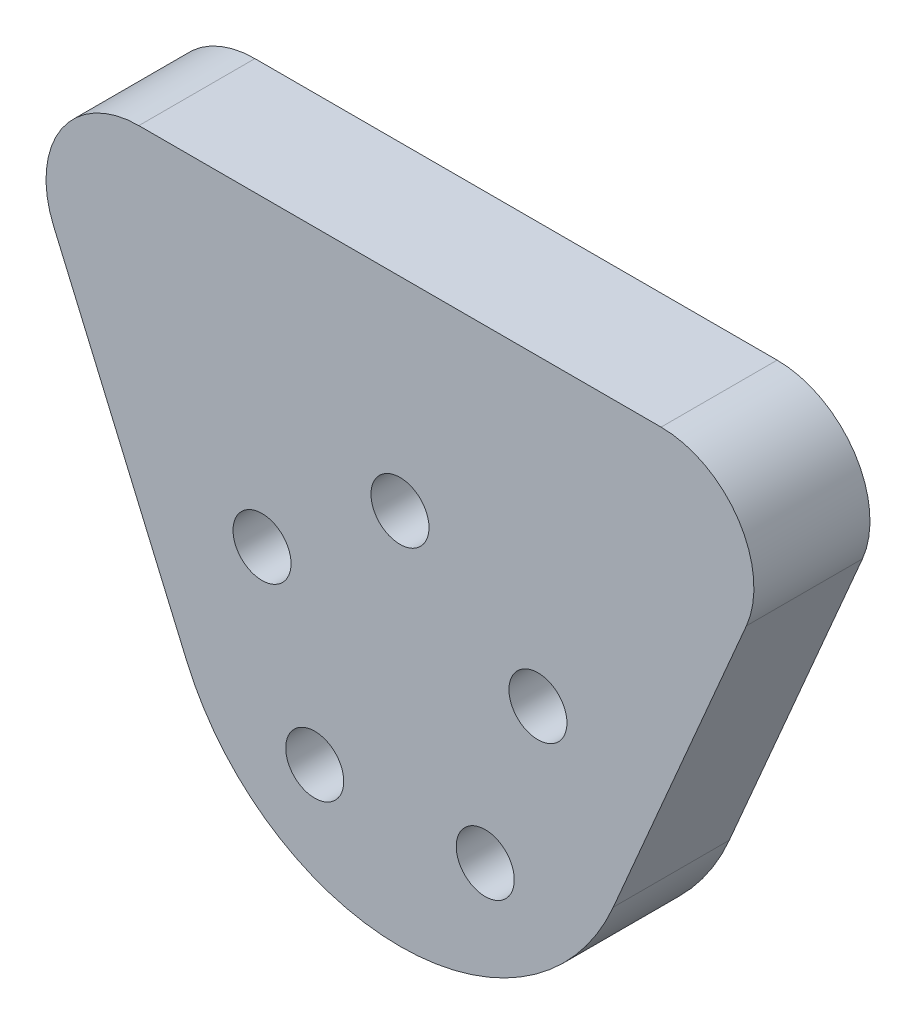
ISO-10303-21;
HEADER;
FILE_DESCRIPTION(('STEP AP214'),'2;1');
FILE_NAME('part.step','',(''),(''),'','','');
FILE_SCHEMA(('AUTOMOTIVE_DESIGN { 1 0 10303 214 1 1 1 1 }'));
ENDSEC;
DATA;
#1=APPLICATION_CONTEXT('core data for automotive mechanical design processes');
#2=APPLICATION_PROTOCOL_DEFINITION('international standard','automotive_design',2000,#1);
#3=PRODUCT_CONTEXT('',#1,'mechanical');
#4=PRODUCT('Part','Part','',(#3));
#5=PRODUCT_RELATED_PRODUCT_CATEGORY('part','',(#4));
#6=PRODUCT_DEFINITION_FORMATION('','',#4);
#7=PRODUCT_DEFINITION_CONTEXT('part definition',#1,'design');
#8=PRODUCT_DEFINITION('design','',#6,#7);
#9=PRODUCT_DEFINITION_SHAPE('','',#8);
#10=(LENGTH_UNIT() NAMED_UNIT(*) SI_UNIT(.MILLI.,.METRE.));
#11=(NAMED_UNIT(*) PLANE_ANGLE_UNIT() SI_UNIT($,.RADIAN.));
#12=(NAMED_UNIT(*) SI_UNIT($,.STERADIAN.) SOLID_ANGLE_UNIT());
#13=UNCERTAINTY_MEASURE_WITH_UNIT(LENGTH_MEASURE(1.E-05),#10,'distance_accuracy_value','');
#14=(GEOMETRIC_REPRESENTATION_CONTEXT(3) GLOBAL_UNCERTAINTY_ASSIGNED_CONTEXT((#13)) GLOBAL_UNIT_ASSIGNED_CONTEXT((#10,
#11,#12)) REPRESENTATION_CONTEXT('',''));
#15=CARTESIAN_POINT('',(0.,0.,0.));
#16=DIRECTION('',(0.,0.,1.));
#17=DIRECTION('',(1.,0.,0.));
#18=AXIS2_PLACEMENT_3D('',#15,#16,#17);
#19=CARTESIAN_POINT('',(-45.,0.,10.));
#20=DIRECTION('',(0.,0.,1.));
#21=DIRECTION('',(1.,0.,0.));
#22=AXIS2_PLACEMENT_3D('',#19,#20,#21);
#23=PLANE('',#22);
#24=CARTESIAN_POINT('',(-29.8473156536559,-32.1127124296868,10.));
#25=DIRECTION('',(0.,0.,1.));
#26=DIRECTION('',(1.,0.,0.));
#27=AXIS2_PLACEMENT_3D('',#24,#25,#26);
#28=CIRCLE('',#27,2.49999999999999);
#29=CARTESIAN_POINT('',(-27.3473156536559,-32.1127124296868,10.));
#30=VERTEX_POINT('',#29);
#31=EDGE_CURVE('E199',#30,#30,#28,.T.);
#32=ORIENTED_EDGE('',*,*,#31,.F.);
#33=EDGE_LOOP('',(#32));
#34=FACE_BOUND('',#33,.T.);
#35=CARTESIAN_POINT('',(-10.6117935463106,-18.1372875703131,10.));
#36=DIRECTION('',(0.,0.,1.));
#37=DIRECTION('',(1.,0.,0.));
#38=AXIS2_PLACEMENT_3D('',#35,#36,#37);
#39=CIRCLE('',#38,2.5);
#40=CARTESIAN_POINT('',(-8.11179354631056,-18.1372875703131,10.));
#41=VERTEX_POINT('',#40);
#42=EDGE_CURVE('E211',#41,#41,#39,.T.);
#43=ORIENTED_EDGE('',*,*,#42,.F.);
#44=EDGE_LOOP('',(#43));
#45=FACE_BOUND('',#44,.T.);
#46=CARTESIAN_POINT('',(-45.,0.,10.));
#47=DIRECTION('',(0.,0.,1.));
#48=DIRECTION('',(1.,0.,0.));
#49=AXIS2_PLACEMENT_3D('',#46,#47,#48);
#50=CIRCLE('',#49,8.);
#51=CARTESIAN_POINT('',(-45.,8.,10.));
#52=VERTEX_POINT('',#51);
#53=CARTESIAN_POINT('',(-52.3515841950434,-3.15502929038525,10.));
#54=VERTEX_POINT('',#53);
#55=EDGE_CURVE('E135',#52,#54,#50,.T.);
#56=ORIENTED_EDGE('',*,*,#55,.T.);
#57=DIRECTION('',(0.394378661298155,-0.918948024380419,0.));
#58=VECTOR('',#57,1.);
#59=CARTESIAN_POINT('',(-52.3515841950434,-3.15502929038525,10.));
#60=LINE('',#59,#58);
#61=CARTESIAN_POINT('',(-40.8789604876084,-29.8875732259631,10.));
#62=VERTEX_POINT('',#61);
#63=EDGE_CURVE('E93',#54,#62,#60,.T.);
#64=ORIENTED_EDGE('',*,*,#63,.T.);
#65=CARTESIAN_POINT('',(-22.5,-22.,10.));
#66=DIRECTION('',(0.,0.,1.));
#67=DIRECTION('',(1.,0.,0.));
#68=AXIS2_PLACEMENT_3D('',#65,#66,#67);
#69=CIRCLE('',#68,20.);
#70=CARTESIAN_POINT('',(-4.12103951239162,-29.8875732259631,10.));
#71=VERTEX_POINT('',#70);
#72=EDGE_CURVE('E106',#62,#71,#69,.T.);
#73=ORIENTED_EDGE('',*,*,#72,.T.);
#74=DIRECTION('',(0.394378661298155,0.918948024380419,0.));
#75=VECTOR('',#74,1.);
#76=CARTESIAN_POINT('',(7.35158419504335,-3.15502929038524,10.));
#77=LINE('',#76,#75);
#78=CARTESIAN_POINT('',(7.35158419504335,-3.15502929038525,10.));
#79=VERTEX_POINT('',#78);
#80=EDGE_CURVE('E100',#71,#79,#77,.T.);
#81=ORIENTED_EDGE('',*,*,#80,.T.);
#82=CARTESIAN_POINT('',(0.,0.,10.));
#83=DIRECTION('',(0.,0.,1.));
#84=DIRECTION('',(1.,0.,0.));
#85=AXIS2_PLACEMENT_3D('',#82,#83,#84);
#86=CIRCLE('',#85,8.);
#87=CARTESIAN_POINT('',(0.,8.,10.));
#88=VERTEX_POINT('',#87);
#89=EDGE_CURVE('E104',#79,#88,#86,.T.);
#90=ORIENTED_EDGE('',*,*,#89,.T.);
#91=DIRECTION('',(-1.,0.,0.));
#92=VECTOR('',#91,1.);
#93=CARTESIAN_POINT('',(-45.,8.,10.));
#94=LINE('',#93,#92);
#95=EDGE_CURVE('E56',#88,#52,#94,.T.);
#96=ORIENTED_EDGE('',*,*,#95,.T.);
#97=EDGE_LOOP('',(#56,#64,#73,#81,#90,#96));
#98=FACE_BOUND('',#97,.T.);
#99=CARTESIAN_POINT('',(-22.5,-9.49999999999999,10.));
#100=DIRECTION('',(0.,0.,1.));
#101=DIRECTION('',(1.,0.,0.));
#102=AXIS2_PLACEMENT_3D('',#99,#100,#101);
#103=CIRCLE('',#102,2.5);
#104=CARTESIAN_POINT('',(-20.,-9.49999999999999,10.));
#105=VERTEX_POINT('',#104);
#106=EDGE_CURVE('E128',#105,#105,#103,.T.);
#107=ORIENTED_EDGE('',*,*,#106,.F.);
#108=EDGE_LOOP('',(#107));
#109=FACE_BOUND('',#108,.T.);
#110=CARTESIAN_POINT('',(-15.1526843463441,-32.1127124296868,10.));
#111=DIRECTION('',(0.,0.,1.));
#112=DIRECTION('',(1.,0.,0.));
#113=AXIS2_PLACEMENT_3D('',#110,#111,#112);
#114=CIRCLE('',#113,2.5);
#115=CARTESIAN_POINT('',(-12.6526843463441,-32.1127124296868,10.));
#116=VERTEX_POINT('',#115);
#117=EDGE_CURVE('E205',#116,#116,#114,.T.);
#118=ORIENTED_EDGE('',*,*,#117,.F.);
#119=EDGE_LOOP('',(#118));
#120=FACE_BOUND('',#119,.T.);
#121=CARTESIAN_POINT('',(-34.3882064536894,-18.1372875703132,10.));
#122=DIRECTION('',(0.,0.,1.));
#123=DIRECTION('',(1.,0.,0.));
#124=AXIS2_PLACEMENT_3D('',#121,#122,#123);
#125=CIRCLE('',#124,2.49999999999999);
#126=CARTESIAN_POINT('',(-31.8882064536894,-18.1372875703132,10.));
#127=VERTEX_POINT('',#126);
#128=EDGE_CURVE('E190',#127,#127,#125,.T.);
#129=ORIENTED_EDGE('',*,*,#128,.F.);
#130=EDGE_LOOP('',(#129));
#131=FACE_BOUND('',#130,.T.);
#132=ADVANCED_FACE('F39',(#34,#45,#98,#109,#120,#131),#23,.T.);
#133=CARTESIAN_POINT('',(-45.,0.,0.));
#134=DIRECTION('',(0.,0.,1.));
#135=DIRECTION('',(1.,0.,0.));
#136=AXIS2_PLACEMENT_3D('',#133,#134,#135);
#137=PLANE('',#136);
#138=CARTESIAN_POINT('',(-45.,0.,0.));
#139=DIRECTION('',(0.,0.,1.));
#140=DIRECTION('',(1.,0.,0.));
#141=AXIS2_PLACEMENT_3D('',#138,#139,#140);
#142=CIRCLE('',#141,8.);
#143=CARTESIAN_POINT('',(-45.,8.,0.));
#144=VERTEX_POINT('',#143);
#145=CARTESIAN_POINT('',(-52.3515841950434,-3.15502929038525,0.));
#146=VERTEX_POINT('',#145);
#147=EDGE_CURVE('E124',#144,#146,#142,.T.);
#148=ORIENTED_EDGE('',*,*,#147,.F.);
#149=DIRECTION('',(-1.,0.,0.));
#150=VECTOR('',#149,1.);
#151=CARTESIAN_POINT('',(-45.,8.,0.));
#152=LINE('',#151,#150);
#153=CARTESIAN_POINT('',(0.,8.,0.));
#154=VERTEX_POINT('',#153);
#155=EDGE_CURVE('E85',#154,#144,#152,.T.);
#156=ORIENTED_EDGE('',*,*,#155,.F.);
#157=CARTESIAN_POINT('',(0.,0.,0.));
#158=DIRECTION('',(0.,0.,1.));
#159=DIRECTION('',(1.,0.,0.));
#160=AXIS2_PLACEMENT_3D('',#157,#158,#159);
#161=CIRCLE('',#160,8.);
#162=CARTESIAN_POINT('',(7.35158419504335,-3.15502929038525,0.));
#163=VERTEX_POINT('',#162);
#164=EDGE_CURVE('E79',#163,#154,#161,.T.);
#165=ORIENTED_EDGE('',*,*,#164,.F.);
#166=DIRECTION('',(0.394378661298155,0.918948024380419,0.));
#167=VECTOR('',#166,1.);
#168=CARTESIAN_POINT('',(7.35158419504335,-3.15502929038524,0.));
#169=LINE('',#168,#167);
#170=CARTESIAN_POINT('',(-4.12103951239162,-29.8875732259631,0.));
#171=VERTEX_POINT('',#170);
#172=EDGE_CURVE('E114',#171,#163,#169,.T.);
#173=ORIENTED_EDGE('',*,*,#172,.F.);
#174=CARTESIAN_POINT('',(-22.5,-22.,0.));
#175=DIRECTION('',(0.,0.,1.));
#176=DIRECTION('',(1.,0.,0.));
#177=AXIS2_PLACEMENT_3D('',#174,#175,#176);
#178=CIRCLE('',#177,20.);
#179=CARTESIAN_POINT('',(-40.8789604876084,-29.8875732259631,0.));
#180=VERTEX_POINT('',#179);
#181=EDGE_CURVE('E130',#180,#171,#178,.T.);
#182=ORIENTED_EDGE('',*,*,#181,.F.);
#183=DIRECTION('',(0.394378661298155,-0.918948024380419,0.));
#184=VECTOR('',#183,1.);
#185=CARTESIAN_POINT('',(-52.3515841950434,-3.15502929038525,0.));
#186=LINE('',#185,#184);
#187=EDGE_CURVE('E127',#146,#180,#186,.T.);
#188=ORIENTED_EDGE('',*,*,#187,.F.);
#189=EDGE_LOOP('',(#148,#156,#165,#173,#182,#188));
#190=FACE_BOUND('',#189,.T.);
#191=CARTESIAN_POINT('',(-22.5,-9.49999999999999,0.));
#192=DIRECTION('',(0.,0.,1.));
#193=DIRECTION('',(1.,0.,0.));
#194=AXIS2_PLACEMENT_3D('',#191,#192,#193);
#195=CIRCLE('',#194,2.5);
#196=CARTESIAN_POINT('',(-20.,-9.49999999999999,0.));
#197=VERTEX_POINT('',#196);
#198=EDGE_CURVE('E214',#197,#197,#195,.T.);
#199=ORIENTED_EDGE('',*,*,#198,.T.);
#200=EDGE_LOOP('',(#199));
#201=FACE_BOUND('',#200,.T.);
#202=CARTESIAN_POINT('',(-10.6117935463106,-18.1372875703131,0.));
#203=DIRECTION('',(0.,0.,1.));
#204=DIRECTION('',(1.,0.,0.));
#205=AXIS2_PLACEMENT_3D('',#202,#203,#204);
#206=CIRCLE('',#205,2.5);
#207=CARTESIAN_POINT('',(-8.11179354631056,-18.1372875703131,0.));
#208=VERTEX_POINT('',#207);
#209=EDGE_CURVE('E208',#208,#208,#206,.T.);
#210=ORIENTED_EDGE('',*,*,#209,.T.);
#211=EDGE_LOOP('',(#210));
#212=FACE_BOUND('',#211,.T.);
#213=CARTESIAN_POINT('',(-15.1526843463441,-32.1127124296868,0.));
#214=DIRECTION('',(0.,0.,1.));
#215=DIRECTION('',(1.,0.,0.));
#216=AXIS2_PLACEMENT_3D('',#213,#214,#215);
#217=CIRCLE('',#216,2.5);
#218=CARTESIAN_POINT('',(-12.6526843463441,-32.1127124296868,0.));
#219=VERTEX_POINT('',#218);
#220=EDGE_CURVE('E202',#219,#219,#217,.T.);
#221=ORIENTED_EDGE('',*,*,#220,.T.);
#222=EDGE_LOOP('',(#221));
#223=FACE_BOUND('',#222,.T.);
#224=CARTESIAN_POINT('',(-29.8473156536559,-32.1127124296868,0.));
#225=DIRECTION('',(0.,0.,1.));
#226=DIRECTION('',(1.,0.,0.));
#227=AXIS2_PLACEMENT_3D('',#224,#225,#226);
#228=CIRCLE('',#227,2.49999999999999);
#229=CARTESIAN_POINT('',(-27.3473156536559,-32.1127124296868,0.));
#230=VERTEX_POINT('',#229);
#231=EDGE_CURVE('E196',#230,#230,#228,.T.);
#232=ORIENTED_EDGE('',*,*,#231,.T.);
#233=EDGE_LOOP('',(#232));
#234=FACE_BOUND('',#233,.T.);
#235=CARTESIAN_POINT('',(-34.3882064536894,-18.1372875703132,0.));
#236=DIRECTION('',(0.,0.,1.));
#237=DIRECTION('',(1.,0.,0.));
#238=AXIS2_PLACEMENT_3D('',#235,#236,#237);
#239=CIRCLE('',#238,2.49999999999999);
#240=CARTESIAN_POINT('',(-31.8882064536894,-18.1372875703132,0.));
#241=VERTEX_POINT('',#240);
#242=EDGE_CURVE('E193',#241,#241,#239,.T.);
#243=ORIENTED_EDGE('',*,*,#242,.T.);
#244=EDGE_LOOP('',(#243));
#245=FACE_BOUND('',#244,.T.);
#246=ADVANCED_FACE('F144',(#190,#201,#212,#223,#234,#245),#137,.F.);
#247=CARTESIAN_POINT('',(-45.,0.,10.));
#248=DIRECTION('',(0.,0.,-1.));
#249=DIRECTION('',(-1.,0.,0.));
#250=AXIS2_PLACEMENT_3D('',#247,#248,#249);
#251=CYLINDRICAL_SURFACE('',#250,8.);
#252=ORIENTED_EDGE('',*,*,#147,.T.);
#253=DIRECTION('',(0.,0.,-1.));
#254=VECTOR('',#253,1.);
#255=CARTESIAN_POINT('',(-52.3515841950434,-3.15502929038525,10.));
#256=LINE('',#255,#254);
#257=EDGE_CURVE('E11',#54,#146,#256,.T.);
#258=ORIENTED_EDGE('',*,*,#257,.F.);
#259=ORIENTED_EDGE('',*,*,#55,.F.);
#260=DIRECTION('',(0.,0.,-1.));
#261=VECTOR('',#260,1.);
#262=CARTESIAN_POINT('',(-45.,8.,10.));
#263=LINE('',#262,#261);
#264=EDGE_CURVE('E120',#52,#144,#263,.T.);
#265=ORIENTED_EDGE('',*,*,#264,.T.);
#266=EDGE_LOOP('',(#252,#258,#259,#265));
#267=FACE_BOUND('',#266,.T.);
#268=ADVANCED_FACE('F41',(#267),#251,.T.);
#269=CARTESIAN_POINT('',(-52.3515841950434,-3.15502929038525,10.));
#270=DIRECTION('',(0.918948024380419,0.394378661298155,0.));
#271=DIRECTION('',(-0.394378661298156,0.918948024380419,0.));
#272=AXIS2_PLACEMENT_3D('',#269,#270,#271);
#273=PLANE('',#272);
#274=ORIENTED_EDGE('',*,*,#187,.T.);
#275=DIRECTION('',(0.,0.,-1.));
#276=VECTOR('',#275,1.);
#277=CARTESIAN_POINT('',(-40.8789604876084,-29.8875732259631,10.));
#278=LINE('',#277,#276);
#279=EDGE_CURVE('E48',#62,#180,#278,.T.);
#280=ORIENTED_EDGE('',*,*,#279,.F.);
#281=ORIENTED_EDGE('',*,*,#63,.F.);
#282=ORIENTED_EDGE('',*,*,#257,.T.);
#283=EDGE_LOOP('',(#274,#280,#281,#282));
#284=FACE_BOUND('',#283,.T.);
#285=ADVANCED_FACE('F273',(#284),#273,.F.);
#286=CARTESIAN_POINT('',(-22.5,-22.,10.));
#287=DIRECTION('',(0.,0.,-1.));
#288=DIRECTION('',(-1.,0.,0.));
#289=AXIS2_PLACEMENT_3D('',#286,#287,#288);
#290=CYLINDRICAL_SURFACE('',#289,20.);
#291=ORIENTED_EDGE('',*,*,#181,.T.);
#292=DIRECTION('',(0.,0.,-1.));
#293=VECTOR('',#292,1.);
#294=CARTESIAN_POINT('',(-4.12103951239162,-29.8875732259631,10.));
#295=LINE('',#294,#293);
#296=EDGE_CURVE('E115',#71,#171,#295,.T.);
#297=ORIENTED_EDGE('',*,*,#296,.F.);
#298=ORIENTED_EDGE('',*,*,#72,.F.);
#299=ORIENTED_EDGE('',*,*,#279,.T.);
#300=EDGE_LOOP('',(#291,#297,#298,#299));
#301=FACE_BOUND('',#300,.T.);
#302=ADVANCED_FACE('F141',(#301),#290,.T.);
#303=CARTESIAN_POINT('',(7.35158419504335,-3.15502929038524,10.));
#304=DIRECTION('',(-0.918948024380419,0.394378661298155,0.));
#305=DIRECTION('',(-0.394378661298156,-0.918948024380419,0.));
#306=AXIS2_PLACEMENT_3D('',#303,#304,#305);
#307=PLANE('',#306);
#308=ORIENTED_EDGE('',*,*,#172,.T.);
#309=DIRECTION('',(0.,0.,-1.));
#310=VECTOR('',#309,1.);
#311=CARTESIAN_POINT('',(7.35158419504335,-3.15502929038525,10.));
#312=LINE('',#311,#310);
#313=EDGE_CURVE('E111',#79,#163,#312,.T.);
#314=ORIENTED_EDGE('',*,*,#313,.F.);
#315=ORIENTED_EDGE('',*,*,#80,.F.);
#316=ORIENTED_EDGE('',*,*,#296,.T.);
#317=EDGE_LOOP('',(#308,#314,#315,#316));
#318=FACE_BOUND('',#317,.T.);
#319=ADVANCED_FACE('F112',(#318),#307,.F.);
#320=CARTESIAN_POINT('',(0.,0.,10.));
#321=DIRECTION('',(0.,0.,-1.));
#322=DIRECTION('',(-1.,0.,0.));
#323=AXIS2_PLACEMENT_3D('',#320,#321,#322);
#324=CYLINDRICAL_SURFACE('',#323,8.);
#325=ORIENTED_EDGE('',*,*,#164,.T.);
#326=DIRECTION('',(0.,0.,-1.));
#327=VECTOR('',#326,1.);
#328=CARTESIAN_POINT('',(0.,8.,10.));
#329=LINE('',#328,#327);
#330=EDGE_CURVE('E116',#88,#154,#329,.T.);
#331=ORIENTED_EDGE('',*,*,#330,.F.);
#332=ORIENTED_EDGE('',*,*,#89,.F.);
#333=ORIENTED_EDGE('',*,*,#313,.T.);
#334=EDGE_LOOP('',(#325,#331,#332,#333));
#335=FACE_BOUND('',#334,.T.);
#336=ADVANCED_FACE('F118',(#335),#324,.T.);
#337=CARTESIAN_POINT('',(-45.,8.,10.));
#338=DIRECTION('',(0.,-1.,0.));
#339=DIRECTION('',(0.,0.,-1.));
#340=AXIS2_PLACEMENT_3D('',#337,#338,#339);
#341=PLANE('',#340);
#342=ORIENTED_EDGE('',*,*,#155,.T.);
#343=ORIENTED_EDGE('',*,*,#264,.F.);
#344=ORIENTED_EDGE('',*,*,#95,.F.);
#345=ORIENTED_EDGE('',*,*,#330,.T.);
#346=EDGE_LOOP('',(#342,#343,#344,#345));
#347=FACE_BOUND('',#346,.T.);
#348=ADVANCED_FACE('F149',(#347),#341,.F.);
#349=CARTESIAN_POINT('',(-22.5,-9.49999999999999,10.));
#350=DIRECTION('',(0.,0.,-1.));
#351=DIRECTION('',(-1.,0.,0.));
#352=AXIS2_PLACEMENT_3D('',#349,#350,#351);
#353=CYLINDRICAL_SURFACE('',#352,2.5);
#354=ORIENTED_EDGE('',*,*,#106,.T.);
#355=EDGE_LOOP('',(#354));
#356=FACE_BOUND('',#355,.T.);
#357=ORIENTED_EDGE('',*,*,#198,.F.);
#358=EDGE_LOOP('',(#357));
#359=FACE_BOUND('',#358,.T.);
#360=ADVANCED_FACE('F151',(#356,#359),#353,.F.);
#361=CARTESIAN_POINT('',(-10.6117935463106,-18.1372875703131,10.));
#362=DIRECTION('',(0.,0.,-1.));
#363=DIRECTION('',(-1.,0.,0.));
#364=AXIS2_PLACEMENT_3D('',#361,#362,#363);
#365=CYLINDRICAL_SURFACE('',#364,2.5);
#366=ORIENTED_EDGE('',*,*,#42,.T.);
#367=EDGE_LOOP('',(#366));
#368=FACE_BOUND('',#367,.T.);
#369=ORIENTED_EDGE('',*,*,#209,.F.);
#370=EDGE_LOOP('',(#369));
#371=FACE_BOUND('',#370,.T.);
#372=ADVANCED_FACE('F157',(#368,#371),#365,.F.);
#373=CARTESIAN_POINT('',(-15.1526843463441,-32.1127124296868,10.));
#374=DIRECTION('',(0.,0.,-1.));
#375=DIRECTION('',(-1.,0.,0.));
#376=AXIS2_PLACEMENT_3D('',#373,#374,#375);
#377=CYLINDRICAL_SURFACE('',#376,2.5);
#378=ORIENTED_EDGE('',*,*,#117,.T.);
#379=EDGE_LOOP('',(#378));
#380=FACE_BOUND('',#379,.T.);
#381=ORIENTED_EDGE('',*,*,#220,.F.);
#382=EDGE_LOOP('',(#381));
#383=FACE_BOUND('',#382,.T.);
#384=ADVANCED_FACE('F173',(#380,#383),#377,.F.);
#385=CARTESIAN_POINT('',(-29.8473156536559,-32.1127124296868,10.));
#386=DIRECTION('',(0.,0.,-1.));
#387=DIRECTION('',(-1.,0.,0.));
#388=AXIS2_PLACEMENT_3D('',#385,#386,#387);
#389=CYLINDRICAL_SURFACE('',#388,2.49999999999999);
#390=ORIENTED_EDGE('',*,*,#31,.T.);
#391=EDGE_LOOP('',(#390));
#392=FACE_BOUND('',#391,.T.);
#393=ORIENTED_EDGE('',*,*,#231,.F.);
#394=EDGE_LOOP('',(#393));
#395=FACE_BOUND('',#394,.T.);
#396=ADVANCED_FACE('F177',(#392,#395),#389,.F.);
#397=CARTESIAN_POINT('',(-34.3882064536894,-18.1372875703132,10.));
#398=DIRECTION('',(0.,0.,-1.));
#399=DIRECTION('',(-1.,0.,0.));
#400=AXIS2_PLACEMENT_3D('',#397,#398,#399);
#401=CYLINDRICAL_SURFACE('',#400,2.49999999999999);
#402=ORIENTED_EDGE('',*,*,#128,.T.);
#403=EDGE_LOOP('',(#402));
#404=FACE_BOUND('',#403,.T.);
#405=ORIENTED_EDGE('',*,*,#242,.F.);
#406=EDGE_LOOP('',(#405));
#407=FACE_BOUND('',#406,.T.);
#408=ADVANCED_FACE('F181',(#404,#407),#401,.F.);
#409=CLOSED_SHELL('',(#132,#246,#268,#285,#302,#319,#336,#348,#360,#372,#384,#396,#408));
#410=MANIFOLD_SOLID_BREP('B2',#409);
#411=ADVANCED_BREP_SHAPE_REPRESENTATION('',(#18,#410),#14);
#412=SHAPE_DEFINITION_REPRESENTATION(#9,#411);
ENDSEC;
END-ISO-10303-21;
